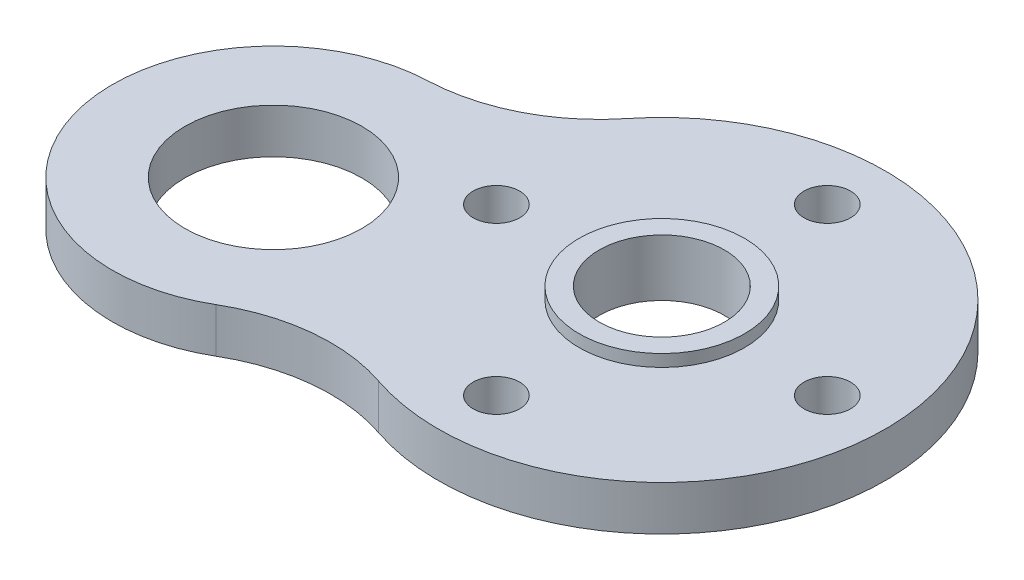
ISO-10303-21;
HEADER;
FILE_DESCRIPTION(('STEP AP214'),'2;1');
FILE_NAME('part.step','',(''),(''),'','','');
FILE_SCHEMA(('AUTOMOTIVE_DESIGN { 1 0 10303 214 1 1 1 1 }'));
ENDSEC;
DATA;
#1=APPLICATION_CONTEXT('core data for automotive mechanical design processes');
#2=APPLICATION_PROTOCOL_DEFINITION('international standard','automotive_design',2000,#1);
#3=PRODUCT_CONTEXT('',#1,'mechanical');
#4=PRODUCT('Part','Part','',(#3));
#5=PRODUCT_RELATED_PRODUCT_CATEGORY('part','',(#4));
#6=PRODUCT_DEFINITION_FORMATION('','',#4);
#7=PRODUCT_DEFINITION_CONTEXT('part definition',#1,'design');
#8=PRODUCT_DEFINITION('design','',#6,#7);
#9=PRODUCT_DEFINITION_SHAPE('','',#8);
#10=(LENGTH_UNIT() NAMED_UNIT(*) SI_UNIT(.MILLI.,.METRE.));
#11=(NAMED_UNIT(*) PLANE_ANGLE_UNIT() SI_UNIT($,.RADIAN.));
#12=(NAMED_UNIT(*) SI_UNIT($,.STERADIAN.) SOLID_ANGLE_UNIT());
#13=UNCERTAINTY_MEASURE_WITH_UNIT(LENGTH_MEASURE(1.E-05),#10,'distance_accuracy_value','');
#14=(GEOMETRIC_REPRESENTATION_CONTEXT(3) GLOBAL_UNCERTAINTY_ASSIGNED_CONTEXT((#13)) GLOBAL_UNIT_ASSIGNED_CONTEXT((#10,
#11,#12)) REPRESENTATION_CONTEXT('',''));
#15=CARTESIAN_POINT('',(0.,0.,0.));
#16=DIRECTION('',(0.,0.,1.));
#17=DIRECTION('',(1.,0.,0.));
#18=AXIS2_PLACEMENT_3D('',#15,#16,#17);
#19=CARTESIAN_POINT('',(0.,5.,0.));
#20=DIRECTION('',(0.,1.,0.));
#21=DIRECTION('',(0.,0.,1.));
#22=AXIS2_PLACEMENT_3D('',#19,#20,#21);
#23=PLANE('',#22);
#24=CARTESIAN_POINT('',(0.,5.,0.));
#25=DIRECTION('',(0.,1.,0.));
#26=DIRECTION('',(0.,0.,1.));
#27=AXIS2_PLACEMENT_3D('',#24,#25,#26);
#28=CIRCLE('',#27,9.25);
#29=CARTESIAN_POINT('',(0.,5.,-9.25));
#30=VERTEX_POINT('',#29);
#31=EDGE_CURVE('E143',#30,#30,#28,.T.);
#32=ORIENTED_EDGE('',*,*,#31,.F.);
#33=EDGE_LOOP('',(#32));
#34=FACE_BOUND('',#33,.T.);
#35=CARTESIAN_POINT('',(5.19004834727206E-13,5.,18.5));
#36=DIRECTION('',(0.,1.,0.));
#37=DIRECTION('',(0.,0.,1.));
#38=AXIS2_PLACEMENT_3D('',#35,#36,#37);
#39=CIRCLE('',#38,2.6);
#40=CARTESIAN_POINT('',(5.19004834727206E-13,5.,21.1));
#41=VERTEX_POINT('',#40);
#42=EDGE_CURVE('E128',#41,#41,#39,.T.);
#43=ORIENTED_EDGE('',*,*,#42,.F.);
#44=EDGE_LOOP('',(#43));
#45=FACE_BOUND('',#44,.T.);
#46=CARTESIAN_POINT('',(0.,5.,-18.5));
#47=DIRECTION('',(0.,1.,0.));
#48=DIRECTION('',(0.,0.,1.));
#49=AXIS2_PLACEMENT_3D('',#46,#47,#48);
#50=CIRCLE('',#49,2.6);
#51=CARTESIAN_POINT('',(0.,5.,-15.9));
#52=VERTEX_POINT('',#51);
#53=EDGE_CURVE('E115',#52,#52,#50,.T.);
#54=ORIENTED_EDGE('',*,*,#53,.F.);
#55=EDGE_LOOP('',(#54));
#56=FACE_BOUND('',#55,.T.);
#57=CARTESIAN_POINT('',(-33.5853762819475,5.,9.85));
#58=DIRECTION('',(0.,1.,0.));
#59=DIRECTION('',(0.,0.,1.));
#60=AXIS2_PLACEMENT_3D('',#57,#58,#59);
#61=CIRCLE('',#60,18.);
#62=CARTESIAN_POINT('',(-24.4886089213786,5.,25.3821866969107));
#63=VERTEX_POINT('',#62);
#64=CARTESIAN_POINT('',(-34.3186273834329,5.,-8.13505887736179));
#65=VERTEX_POINT('',#64);
#66=EDGE_CURVE('E88',#63,#65,#61,.F.);
#67=ORIENTED_EDGE('',*,*,#66,.F.);
#68=CARTESIAN_POINT('',(-14.3810896318576,5.,42.6401719157003));
#69=DIRECTION('',(0.,1.,0.));
#70=DIRECTION('',(0.,0.,1.));
#71=AXIS2_PLACEMENT_3D('',#68,#69,#70);
#72=CIRCLE('',#71,20.);
#73=CARTESIAN_POINT('',(-7.98949423992091,5.,23.6889843976113));
#74=VERTEX_POINT('',#73);
#75=EDGE_CURVE('E11',#63,#74,#72,.F.);
#76=ORIENTED_EDGE('',*,*,#75,.T.);
#77=CARTESIAN_POINT('',(0.,5.,0.));
#78=DIRECTION('',(0.,1.,0.));
#79=DIRECTION('',(0.,0.,1.));
#80=AXIS2_PLACEMENT_3D('',#77,#78,#79);
#81=CIRCLE('',#80,25.);
#82=CARTESIAN_POINT('',(-19.5185282386266,5.,-15.6213653499922));
#83=VERTEX_POINT('',#82);
#84=EDGE_CURVE('E94',#74,#83,#81,.T.);
#85=ORIENTED_EDGE('',*,*,#84,.T.);
#86=CARTESIAN_POINT('',(-35.1333508295278,5.,-28.118457629986));
#87=DIRECTION('',(0.,1.,0.));
#88=DIRECTION('',(0.,0.,1.));
#89=AXIS2_PLACEMENT_3D('',#86,#87,#88);
#90=CIRCLE('',#89,20.);
#91=EDGE_CURVE('E98',#83,#65,#90,.F.);
#92=ORIENTED_EDGE('',*,*,#91,.T.);
#93=EDGE_LOOP('',(#67,#76,#85,#92));
#94=FACE_BOUND('',#93,.T.);
#95=CARTESIAN_POINT('',(18.5,5.,0.));
#96=DIRECTION('',(0.,1.,0.));
#97=DIRECTION('',(0.,0.,1.));
#98=AXIS2_PLACEMENT_3D('',#95,#96,#97);
#99=CIRCLE('',#98,2.6);
#100=CARTESIAN_POINT('',(18.5,5.,2.60000000000006));
#101=VERTEX_POINT('',#100);
#102=EDGE_CURVE('E123',#101,#101,#99,.T.);
#103=ORIENTED_EDGE('',*,*,#102,.F.);
#104=EDGE_LOOP('',(#103));
#105=FACE_BOUND('',#104,.T.);
#106=CARTESIAN_POINT('',(-18.5,5.,-1.93777214305794E-13));
#107=DIRECTION('',(0.,1.,0.));
#108=DIRECTION('',(0.,0.,1.));
#109=AXIS2_PLACEMENT_3D('',#106,#107,#108);
#110=CIRCLE('',#109,2.6);
#111=CARTESIAN_POINT('',(-18.5,5.,2.59999999999981));
#112=VERTEX_POINT('',#111);
#113=EDGE_CURVE('E134',#112,#112,#110,.T.);
#114=ORIENTED_EDGE('',*,*,#113,.F.);
#115=EDGE_LOOP('',(#114));
#116=FACE_BOUND('',#115,.T.);
#117=CARTESIAN_POINT('',(-33.5853762819475,5.,9.85));
#118=DIRECTION('',(0.,1.,0.));
#119=DIRECTION('',(0.,0.,1.));
#120=AXIS2_PLACEMENT_3D('',#117,#118,#119);
#121=CIRCLE('',#120,9.9);
#122=CARTESIAN_POINT('',(-33.5853762819475,5.,-0.0499999999999997));
#123=VERTEX_POINT('',#122);
#124=EDGE_CURVE('E152',#123,#123,#121,.F.);
#125=ORIENTED_EDGE('',*,*,#124,.T.);
#126=EDGE_LOOP('',(#125));
#127=FACE_BOUND('',#126,.T.);
#128=ADVANCED_FACE('F43',(#34,#45,#56,#94,#105,#116,#127),#23,.T.);
#129=CARTESIAN_POINT('',(0.,0.,0.));
#130=DIRECTION('',(0.,1.,0.));
#131=DIRECTION('',(0.,0.,1.));
#132=AXIS2_PLACEMENT_3D('',#129,#130,#131);
#133=PLANE('',#132);
#134=CARTESIAN_POINT('',(0.,0.,0.));
#135=DIRECTION('',(0.,1.,0.));
#136=DIRECTION('',(0.,0.,1.));
#137=AXIS2_PLACEMENT_3D('',#134,#135,#136);
#138=CIRCLE('',#137,7.);
#139=CARTESIAN_POINT('',(0.,0.,7.));
#140=VERTEX_POINT('',#139);
#141=EDGE_CURVE('E146',#140,#140,#138,.T.);
#142=ORIENTED_EDGE('',*,*,#141,.T.);
#143=EDGE_LOOP('',(#142));
#144=FACE_BOUND('',#143,.T.);
#145=CARTESIAN_POINT('',(0.,0.,0.));
#146=DIRECTION('',(0.,1.,0.));
#147=DIRECTION('',(0.,0.,1.));
#148=AXIS2_PLACEMENT_3D('',#145,#146,#147);
#149=CIRCLE('',#148,25.);
#150=CARTESIAN_POINT('',(-7.98949423992091,0.,23.6889843976113));
#151=VERTEX_POINT('',#150);
#152=CARTESIAN_POINT('',(-19.5185282386266,0.,-15.6213653499922));
#153=VERTEX_POINT('',#152);
#154=EDGE_CURVE('E114',#151,#153,#149,.T.);
#155=ORIENTED_EDGE('',*,*,#154,.F.);
#156=CARTESIAN_POINT('',(-14.3810896318576,0.,42.6401719157003));
#157=DIRECTION('',(0.,1.,0.));
#158=DIRECTION('',(0.,0.,1.));
#159=AXIS2_PLACEMENT_3D('',#156,#157,#158);
#160=CIRCLE('',#159,20.);
#161=CARTESIAN_POINT('',(-24.4886089213786,0.,25.3821866969107));
#162=VERTEX_POINT('',#161);
#163=EDGE_CURVE('E51',#151,#162,#160,.T.);
#164=ORIENTED_EDGE('',*,*,#163,.T.);
#165=CARTESIAN_POINT('',(-33.5853762819475,0.,9.85));
#166=DIRECTION('',(0.,-1.,0.));
#167=DIRECTION('',(0.,0.,-1.));
#168=AXIS2_PLACEMENT_3D('',#165,#166,#167);
#169=CIRCLE('',#168,18.);
#170=CARTESIAN_POINT('',(-34.3186273834329,0.,-8.13505887736179));
#171=VERTEX_POINT('',#170);
#172=EDGE_CURVE('E91',#162,#171,#169,.T.);
#173=ORIENTED_EDGE('',*,*,#172,.T.);
#174=CARTESIAN_POINT('',(-35.1333508295278,0.,-28.118457629986));
#175=DIRECTION('',(0.,1.,0.));
#176=DIRECTION('',(0.,0.,1.));
#177=AXIS2_PLACEMENT_3D('',#174,#175,#176);
#178=CIRCLE('',#177,20.);
#179=EDGE_CURVE('E106',#171,#153,#178,.T.);
#180=ORIENTED_EDGE('',*,*,#179,.T.);
#181=EDGE_LOOP('',(#155,#164,#173,#180));
#182=FACE_BOUND('',#181,.T.);
#183=CARTESIAN_POINT('',(0.,0.,-18.5));
#184=DIRECTION('',(0.,1.,0.));
#185=DIRECTION('',(0.,0.,1.));
#186=AXIS2_PLACEMENT_3D('',#183,#184,#185);
#187=CIRCLE('',#186,2.6);
#188=CARTESIAN_POINT('',(0.,0.,-15.9));
#189=VERTEX_POINT('',#188);
#190=EDGE_CURVE('E119',#189,#189,#187,.T.);
#191=ORIENTED_EDGE('',*,*,#190,.T.);
#192=EDGE_LOOP('',(#191));
#193=FACE_BOUND('',#192,.T.);
#194=CARTESIAN_POINT('',(18.5,0.,0.));
#195=DIRECTION('',(0.,1.,0.));
#196=DIRECTION('',(0.,0.,1.));
#197=AXIS2_PLACEMENT_3D('',#194,#195,#196);
#198=CIRCLE('',#197,2.6);
#199=CARTESIAN_POINT('',(18.5,0.,2.60000000000006));
#200=VERTEX_POINT('',#199);
#201=EDGE_CURVE('E125',#200,#200,#198,.T.);
#202=ORIENTED_EDGE('',*,*,#201,.T.);
#203=EDGE_LOOP('',(#202));
#204=FACE_BOUND('',#203,.T.);
#205=CARTESIAN_POINT('',(5.19004834727206E-13,0.,18.5));
#206=DIRECTION('',(0.,1.,0.));
#207=DIRECTION('',(0.,0.,1.));
#208=AXIS2_PLACEMENT_3D('',#205,#206,#207);
#209=CIRCLE('',#208,2.6);
#210=CARTESIAN_POINT('',(5.19004834727206E-13,0.,21.1));
#211=VERTEX_POINT('',#210);
#212=EDGE_CURVE('E131',#211,#211,#209,.T.);
#213=ORIENTED_EDGE('',*,*,#212,.T.);
#214=EDGE_LOOP('',(#213));
#215=FACE_BOUND('',#214,.T.);
#216=CARTESIAN_POINT('',(-18.5,0.,-1.93777214305794E-13));
#217=DIRECTION('',(0.,1.,0.));
#218=DIRECTION('',(0.,0.,1.));
#219=AXIS2_PLACEMENT_3D('',#216,#217,#218);
#220=CIRCLE('',#219,2.6);
#221=CARTESIAN_POINT('',(-18.5,0.,2.59999999999981));
#222=VERTEX_POINT('',#221);
#223=EDGE_CURVE('E137',#222,#222,#220,.T.);
#224=ORIENTED_EDGE('',*,*,#223,.T.);
#225=EDGE_LOOP('',(#224));
#226=FACE_BOUND('',#225,.T.);
#227=CARTESIAN_POINT('',(-33.5853762819475,0.,9.85));
#228=DIRECTION('',(0.,-1.,0.));
#229=DIRECTION('',(0.,0.,-1.));
#230=AXIS2_PLACEMENT_3D('',#227,#228,#229);
#231=CIRCLE('',#230,9.9);
#232=CARTESIAN_POINT('',(-33.5853762819475,0.,-0.0499999999999997));
#233=VERTEX_POINT('',#232);
#234=EDGE_CURVE('E99',#233,#233,#231,.T.);
#235=ORIENTED_EDGE('',*,*,#234,.F.);
#236=EDGE_LOOP('',(#235));
#237=FACE_BOUND('',#236,.T.);
#238=ADVANCED_FACE('F112',(#144,#182,#193,#204,#215,#226,#237),#133,.F.);
#239=CARTESIAN_POINT('',(0.,5.,0.));
#240=DIRECTION('',(0.,-1.,0.));
#241=DIRECTION('',(0.,0.,-1.));
#242=AXIS2_PLACEMENT_3D('',#239,#240,#241);
#243=CYLINDRICAL_SURFACE('',#242,25.);
#244=ORIENTED_EDGE('',*,*,#154,.T.);
#245=DIRECTION('',(0.,-1.,0.));
#246=VECTOR('',#245,1.);
#247=CARTESIAN_POINT('',(-19.5185282386266,5.,-15.6213653499922));
#248=LINE('',#247,#246);
#249=EDGE_CURVE('E58',#153,#83,#248,.F.);
#250=ORIENTED_EDGE('',*,*,#249,.T.);
#251=ORIENTED_EDGE('',*,*,#84,.F.);
#252=DIRECTION('',(0.,-1.,0.));
#253=VECTOR('',#252,1.);
#254=CARTESIAN_POINT('',(-7.98949423992091,5.,23.6889843976113));
#255=LINE('',#254,#253);
#256=EDGE_CURVE('E103',#74,#151,#255,.T.);
#257=ORIENTED_EDGE('',*,*,#256,.T.);
#258=EDGE_LOOP('',(#244,#250,#251,#257));
#259=FACE_BOUND('',#258,.T.);
#260=ADVANCED_FACE('F165',(#259),#243,.T.);
#261=CARTESIAN_POINT('',(0.,5.,-18.5));
#262=DIRECTION('',(0.,-1.,0.));
#263=DIRECTION('',(0.,0.,-1.));
#264=AXIS2_PLACEMENT_3D('',#261,#262,#263);
#265=CYLINDRICAL_SURFACE('',#264,2.6);
#266=ORIENTED_EDGE('',*,*,#53,.T.);
#267=EDGE_LOOP('',(#266));
#268=FACE_BOUND('',#267,.T.);
#269=ORIENTED_EDGE('',*,*,#190,.F.);
#270=EDGE_LOOP('',(#269));
#271=FACE_BOUND('',#270,.T.);
#272=ADVANCED_FACE('F172',(#268,#271),#265,.F.);
#273=CARTESIAN_POINT('',(18.5,5.,0.));
#274=DIRECTION('',(0.,-1.,0.));
#275=DIRECTION('',(0.,0.,-1.));
#276=AXIS2_PLACEMENT_3D('',#273,#274,#275);
#277=CYLINDRICAL_SURFACE('',#276,2.6);
#278=ORIENTED_EDGE('',*,*,#102,.T.);
#279=EDGE_LOOP('',(#278));
#280=FACE_BOUND('',#279,.T.);
#281=ORIENTED_EDGE('',*,*,#201,.F.);
#282=EDGE_LOOP('',(#281));
#283=FACE_BOUND('',#282,.T.);
#284=ADVANCED_FACE('F209',(#280,#283),#277,.F.);
#285=CARTESIAN_POINT('',(5.19004834727206E-13,5.,18.5));
#286=DIRECTION('',(0.,-1.,0.));
#287=DIRECTION('',(0.,0.,-1.));
#288=AXIS2_PLACEMENT_3D('',#285,#286,#287);
#289=CYLINDRICAL_SURFACE('',#288,2.6);
#290=ORIENTED_EDGE('',*,*,#42,.T.);
#291=EDGE_LOOP('',(#290));
#292=FACE_BOUND('',#291,.T.);
#293=ORIENTED_EDGE('',*,*,#212,.F.);
#294=EDGE_LOOP('',(#293));
#295=FACE_BOUND('',#294,.T.);
#296=ADVANCED_FACE('F205',(#292,#295),#289,.F.);
#297=CARTESIAN_POINT('',(-18.5,5.,-1.93777214305794E-13));
#298=DIRECTION('',(0.,-1.,0.));
#299=DIRECTION('',(0.,0.,-1.));
#300=AXIS2_PLACEMENT_3D('',#297,#298,#299);
#301=CYLINDRICAL_SURFACE('',#300,2.6);
#302=ORIENTED_EDGE('',*,*,#113,.T.);
#303=EDGE_LOOP('',(#302));
#304=FACE_BOUND('',#303,.T.);
#305=ORIENTED_EDGE('',*,*,#223,.F.);
#306=EDGE_LOOP('',(#305));
#307=FACE_BOUND('',#306,.T.);
#308=ADVANCED_FACE('F201',(#304,#307),#301,.F.);
#309=CARTESIAN_POINT('',(0.,6.35,0.));
#310=DIRECTION('',(0.,-1.,0.));
#311=DIRECTION('',(0.,0.,-1.));
#312=AXIS2_PLACEMENT_3D('',#309,#310,#311);
#313=CYLINDRICAL_SURFACE('',#312,9.25);
#314=CARTESIAN_POINT('',(0.,6.35,0.));
#315=DIRECTION('',(0.,1.,0.));
#316=DIRECTION('',(0.,0.,1.));
#317=AXIS2_PLACEMENT_3D('',#314,#315,#316);
#318=CIRCLE('',#317,9.25);
#319=CARTESIAN_POINT('',(0.,6.35,-9.25));
#320=VERTEX_POINT('',#319);
#321=EDGE_CURVE('E140',#320,#320,#318,.T.);
#322=CARTESIAN_POINT('',(0.,6.35,-9.25));
#323=CARTESIAN_POINT('',(0.,6.3359375,-9.25));
#324=CARTESIAN_POINT('',(0.,6.321875,-9.25));
#325=CARTESIAN_POINT('',(0.,6.29375,-9.25));
#326=CARTESIAN_POINT('',(0.,6.2796875,-9.25));
#327=CARTESIAN_POINT('',(0.,6.2515625,-9.25));
#328=CARTESIAN_POINT('',(0.,6.2375,-9.25));
#329=CARTESIAN_POINT('',(0.,6.209375,-9.25));
#330=CARTESIAN_POINT('',(0.,6.1953125,-9.25));
#331=CARTESIAN_POINT('',(0.,6.1671875,-9.25));
#332=CARTESIAN_POINT('',(0.,6.153125,-9.25));
#333=CARTESIAN_POINT('',(0.,6.125,-9.25));
#334=CARTESIAN_POINT('',(0.,6.1109375,-9.25));
#335=CARTESIAN_POINT('',(0.,6.0828125,-9.25));
#336=CARTESIAN_POINT('',(0.,6.06875,-9.25));
#337=CARTESIAN_POINT('',(0.,6.040625,-9.25));
#338=CARTESIAN_POINT('',(0.,6.0265625,-9.25));
#339=CARTESIAN_POINT('',(0.,5.9984375,-9.25));
#340=CARTESIAN_POINT('',(0.,5.984375,-9.25));
#341=CARTESIAN_POINT('',(0.,5.95625,-9.25));
#342=CARTESIAN_POINT('',(0.,5.9421875,-9.25));
#343=CARTESIAN_POINT('',(0.,5.9140625,-9.25));
#344=CARTESIAN_POINT('',(0.,5.9,-9.25));
#345=CARTESIAN_POINT('',(0.,5.871875,-9.25));
#346=CARTESIAN_POINT('',(0.,5.8578125,-9.25));
#347=CARTESIAN_POINT('',(0.,5.8296875,-9.25));
#348=CARTESIAN_POINT('',(0.,5.815625,-9.25));
#349=CARTESIAN_POINT('',(0.,5.7875,-9.25));
#350=CARTESIAN_POINT('',(0.,5.7734375,-9.25));
#351=CARTESIAN_POINT('',(0.,5.7453125,-9.25));
#352=CARTESIAN_POINT('',(0.,5.73125,-9.25));
#353=CARTESIAN_POINT('',(0.,5.703125,-9.25));
#354=CARTESIAN_POINT('',(0.,5.6890625,-9.25));
#355=CARTESIAN_POINT('',(0.,5.6609375,-9.25));
#356=CARTESIAN_POINT('',(0.,5.646875,-9.25));
#357=CARTESIAN_POINT('',(0.,5.61875,-9.25));
#358=CARTESIAN_POINT('',(0.,5.6046875,-9.25));
#359=CARTESIAN_POINT('',(0.,5.5765625,-9.25));
#360=CARTESIAN_POINT('',(0.,5.5625,-9.25));
#361=CARTESIAN_POINT('',(0.,5.534375,-9.25));
#362=CARTESIAN_POINT('',(0.,5.5203125,-9.25));
#363=CARTESIAN_POINT('',(0.,5.4921875,-9.25));
#364=CARTESIAN_POINT('',(0.,5.478125,-9.25));
#365=CARTESIAN_POINT('',(0.,5.45,-9.25));
#366=CARTESIAN_POINT('',(0.,5.4359375,-9.25));
#367=CARTESIAN_POINT('',(0.,5.4078125,-9.25));
#368=CARTESIAN_POINT('',(0.,5.39375,-9.25));
#369=CARTESIAN_POINT('',(0.,5.365625,-9.25));
#370=CARTESIAN_POINT('',(0.,5.3515625,-9.25));
#371=CARTESIAN_POINT('',(0.,5.3234375,-9.25));
#372=CARTESIAN_POINT('',(0.,5.309375,-9.25));
#373=CARTESIAN_POINT('',(0.,5.28125,-9.25));
#374=CARTESIAN_POINT('',(0.,5.2671875,-9.25));
#375=CARTESIAN_POINT('',(0.,5.2390625,-9.25));
#376=CARTESIAN_POINT('',(0.,5.225,-9.25));
#377=CARTESIAN_POINT('',(0.,5.196875,-9.25));
#378=CARTESIAN_POINT('',(0.,5.1828125,-9.25));
#379=CARTESIAN_POINT('',(0.,5.1546875,-9.25));
#380=CARTESIAN_POINT('',(0.,5.140625,-9.25));
#381=CARTESIAN_POINT('',(0.,5.1125,-9.25));
#382=CARTESIAN_POINT('',(0.,5.0984375,-9.25));
#383=CARTESIAN_POINT('',(0.,5.0703125,-9.25));
#384=CARTESIAN_POINT('',(0.,5.05625,-9.25));
#385=CARTESIAN_POINT('',(0.,5.028125,-9.25));
#386=CARTESIAN_POINT('',(0.,5.0140625,-9.25));
#387=CARTESIAN_POINT('',(0.,5.,-9.25));
#388=B_SPLINE_CURVE_WITH_KNOTS('',3,(#322,#323,#324,#325,#326,#327,#328,#329,#330,#331,#332,
#333,#334,#335,#336,#337,#338,#339,#340,#341,#342,#343,#344,#345,#346,#347,#348,#349,#350,#351,
#352,#353,#354,#355,#356,#357,#358,#359,#360,#361,#362,#363,#364,#365,#366,#367,#368,#369,#370,
#371,#372,#373,#374,#375,#376,#377,#378,#379,#380,#381,#382,#383,#384,#385,#386,#387),
.UNSPECIFIED.,.F.,.F.,(4,2,2,2,2,2,2,2,2,2,2,2,2,2,2,2,2,2,2,2,2,2,2,2,2,2,2,2,2,2,2,2,4),(0.,
0.0421875000000006,0.0843750000000003,0.1265625,0.168750000000001,0.2109375,0.253125,0.2953125,
0.3375,0.379687500000001,0.421875,0.4640625,0.50625,0.5484375,0.590625,0.6328125,0.675,
0.7171875,0.759375,0.8015625,0.84375,0.8859375,0.928125,0.9703125,1.0125,1.0546875,1.096875,
1.1390625,1.18125,1.2234375,1.265625,1.3078125,1.35),.UNSPECIFIED.);
#389=EDGE_CURVE('BSEAM197',#320,#30,#388,.T.);
#390=ORIENTED_EDGE('',*,*,#321,.F.);
#391=ORIENTED_EDGE('',*,*,#31,.T.);
#392=ORIENTED_EDGE('',*,*,#389,.T.);
#393=ORIENTED_EDGE('',*,*,#389,.F.);
#394=EDGE_LOOP('',(#390,#392,#391,#393));
#395=FACE_BOUND('',#394,.T.);
#396=ADVANCED_FACE('F197',(#395),#313,.T.);
#397=CARTESIAN_POINT('',(0.,6.35,0.));
#398=DIRECTION('',(0.,1.,0.));
#399=DIRECTION('',(0.,0.,1.));
#400=AXIS2_PLACEMENT_3D('',#397,#398,#399);
#401=PLANE('',#400);
#402=CARTESIAN_POINT('',(0.,6.35,0.));
#403=DIRECTION('',(0.,1.,0.));
#404=DIRECTION('',(0.,0.,1.));
#405=AXIS2_PLACEMENT_3D('',#402,#403,#404);
#406=CIRCLE('',#405,7.);
#407=CARTESIAN_POINT('',(0.,6.35,7.));
#408=VERTEX_POINT('',#407);
#409=EDGE_CURVE('E149',#408,#408,#406,.T.);
#410=ORIENTED_EDGE('',*,*,#409,.F.);
#411=EDGE_LOOP('',(#410));
#412=FACE_BOUND('',#411,.T.);
#413=ORIENTED_EDGE('',*,*,#321,.T.);
#414=EDGE_LOOP('',(#413));
#415=FACE_BOUND('',#414,.T.);
#416=ADVANCED_FACE('F193',(#412,#415),#401,.T.);
#417=CARTESIAN_POINT('',(0.,0.,0.));
#418=DIRECTION('',(0.,1.,0.));
#419=DIRECTION('',(0.,0.,1.));
#420=AXIS2_PLACEMENT_3D('',#417,#418,#419);
#421=CYLINDRICAL_SURFACE('',#420,7.);
#422=ORIENTED_EDGE('',*,*,#141,.F.);
#423=EDGE_LOOP('',(#422));
#424=FACE_BOUND('',#423,.T.);
#425=ORIENTED_EDGE('',*,*,#409,.T.);
#426=EDGE_LOOP('',(#425));
#427=FACE_BOUND('',#426,.T.);
#428=ADVANCED_FACE('F189',(#424,#427),#421,.F.);
#429=CARTESIAN_POINT('',(-33.5853762819475,54.5936162428813,9.85));
#430=DIRECTION('',(0.,-1.,0.));
#431=DIRECTION('',(0.,0.,-1.));
#432=AXIS2_PLACEMENT_3D('',#429,#430,#431);
#433=CYLINDRICAL_SURFACE('',#432,18.);
#434=ORIENTED_EDGE('',*,*,#66,.T.);
#435=DIRECTION('',(0.,-1.,0.));
#436=VECTOR('',#435,1.);
#437=CARTESIAN_POINT('',(-34.3186273834329,54.5936162428813,-8.1350588773618));
#438=LINE('',#437,#436);
#439=EDGE_CURVE('E93',#65,#171,#438,.T.);
#440=ORIENTED_EDGE('',*,*,#439,.T.);
#441=ORIENTED_EDGE('',*,*,#172,.F.);
#442=DIRECTION('',(0.,-1.,0.));
#443=VECTOR('',#442,1.);
#444=CARTESIAN_POINT('',(-24.4886089213786,54.5936162428813,25.3821866969107));
#445=LINE('',#444,#443);
#446=EDGE_CURVE('E85',#162,#63,#445,.F.);
#447=ORIENTED_EDGE('',*,*,#446,.T.);
#448=EDGE_LOOP('',(#434,#440,#441,#447));
#449=FACE_BOUND('',#448,.T.);
#450=ADVANCED_FACE('F86',(#449),#433,.T.);
#451=CARTESIAN_POINT('',(-33.5853762819475,54.5936162428813,9.85));
#452=DIRECTION('',(0.,-1.,0.));
#453=DIRECTION('',(0.,0.,-1.));
#454=AXIS2_PLACEMENT_3D('',#451,#452,#453);
#455=CYLINDRICAL_SURFACE('',#454,9.9);
#456=CARTESIAN_POINT('',(-33.5853762819475,0.,-0.0499999999999997));
#457=CARTESIAN_POINT('',(-33.5853762819475,0.0520833333333392,-0.0499999999999997));
#458=CARTESIAN_POINT('',(-33.5853762819475,0.104166666666671,-0.0499999999999997));
#459=CARTESIAN_POINT('',(-33.5853762819475,0.208333333333338,-0.0499999999999997));
#460=CARTESIAN_POINT('',(-33.5853762819475,0.260416666666673,-0.0499999999999997));
#461=CARTESIAN_POINT('',(-33.5853762819475,0.364583333333339,-0.0499999999999997));
#462=CARTESIAN_POINT('',(-33.5853762819475,0.416666666666672,-0.0499999999999997));
#463=CARTESIAN_POINT('',(-33.5853762819475,0.520833333333338,-0.0499999999999997));
#464=CARTESIAN_POINT('',(-33.5853762819475,0.572916666666673,-0.0499999999999997));
#465=CARTESIAN_POINT('',(-33.5853762819475,0.67708333333334,-0.0499999999999997));
#466=CARTESIAN_POINT('',(-33.5853762819475,0.729166666666672,-0.0499999999999997));
#467=CARTESIAN_POINT('',(-33.5853762819475,0.833333333333339,-0.0499999999999997));
#468=CARTESIAN_POINT('',(-33.5853762819475,0.885416666666673,-0.0499999999999997));
#469=CARTESIAN_POINT('',(-33.5853762819475,0.98958333333334,-0.0499999999999997));
#470=CARTESIAN_POINT('',(-33.5853762819475,1.04166666666667,-0.0499999999999997));
#471=CARTESIAN_POINT('',(-33.5853762819475,1.14583333333334,-0.0499999999999997));
#472=CARTESIAN_POINT('',(-33.5853762819475,1.19791666666667,-0.0499999999999997));
#473=CARTESIAN_POINT('',(-33.5853762819475,1.30208333333334,-0.0499999999999997));
#474=CARTESIAN_POINT('',(-33.5853762819475,1.35416666666667,-0.0499999999999997));
#475=CARTESIAN_POINT('',(-33.5853762819475,1.45833333333334,-0.0499999999999997));
#476=CARTESIAN_POINT('',(-33.5853762819475,1.51041666666667,-0.0499999999999997));
#477=CARTESIAN_POINT('',(-33.5853762819475,1.61458333333334,-0.0499999999999997));
#478=CARTESIAN_POINT('',(-33.5853762819475,1.66666666666667,-0.0499999999999997));
#479=CARTESIAN_POINT('',(-33.5853762819475,1.77083333333334,-0.0499999999999997));
#480=CARTESIAN_POINT('',(-33.5853762819475,1.82291666666667,-0.0499999999999997));
#481=CARTESIAN_POINT('',(-33.5853762819475,1.92708333333334,-0.0499999999999997));
#482=CARTESIAN_POINT('',(-33.5853762819475,1.97916666666667,-0.0499999999999997));
#483=CARTESIAN_POINT('',(-33.5853762819475,2.08333333333334,-0.0499999999999997));
#484=CARTESIAN_POINT('',(-33.5853762819475,2.13541666666667,-0.0499999999999997));
#485=CARTESIAN_POINT('',(-33.5853762819475,2.23958333333334,-0.0499999999999997));
#486=CARTESIAN_POINT('',(-33.5853762819475,2.29166666666667,-0.0499999999999997));
#487=CARTESIAN_POINT('',(-33.5853762819475,2.39583333333334,-0.0499999999999997));
#488=CARTESIAN_POINT('',(-33.5853762819475,2.44791666666667,-0.0499999999999997));
#489=CARTESIAN_POINT('',(-33.5853762819475,2.55208333333333,-0.0499999999999997));
#490=CARTESIAN_POINT('',(-33.5853762819475,2.60416666666667,-0.0499999999999997));
#491=CARTESIAN_POINT('',(-33.5853762819475,2.70833333333333,-0.0499999999999997));
#492=CARTESIAN_POINT('',(-33.5853762819475,2.76041666666667,-0.0499999999999997));
#493=CARTESIAN_POINT('',(-33.5853762819475,2.86458333333333,-0.0499999999999997));
#494=CARTESIAN_POINT('',(-33.5853762819475,2.91666666666667,-0.0499999999999997));
#495=CARTESIAN_POINT('',(-33.5853762819475,3.02083333333333,-0.0499999999999997));
#496=CARTESIAN_POINT('',(-33.5853762819475,3.07291666666667,-0.0499999999999997));
#497=CARTESIAN_POINT('',(-33.5853762819475,3.17708333333334,-0.0499999999999997));
#498=CARTESIAN_POINT('',(-33.5853762819475,3.22916666666667,-0.0499999999999997));
#499=CARTESIAN_POINT('',(-33.5853762819475,3.33333333333333,-0.0499999999999997));
#500=CARTESIAN_POINT('',(-33.5853762819475,3.38541666666667,-0.0499999999999997));
#501=CARTESIAN_POINT('',(-33.5853762819475,3.48958333333334,-0.0499999999999997));
#502=CARTESIAN_POINT('',(-33.5853762819475,3.54166666666667,-0.0499999999999997));
#503=CARTESIAN_POINT('',(-33.5853762819475,3.64583333333333,-0.0499999999999997));
#504=CARTESIAN_POINT('',(-33.5853762819475,3.69791666666666,-0.0499999999999997));
#505=CARTESIAN_POINT('',(-33.5853762819475,3.80208333333333,-0.0499999999999997));
#506=CARTESIAN_POINT('',(-33.5853762819475,3.85416666666667,-0.0499999999999997));
#507=CARTESIAN_POINT('',(-33.5853762819475,3.95833333333333,-0.0499999999999997));
#508=CARTESIAN_POINT('',(-33.5853762819475,4.01041666666666,-0.0499999999999997));
#509=CARTESIAN_POINT('',(-33.5853762819475,4.11458333333333,-0.0499999999999997));
#510=CARTESIAN_POINT('',(-33.5853762819475,4.16666666666667,-0.0499999999999997));
#511=CARTESIAN_POINT('',(-33.5853762819475,4.27083333333333,-0.0499999999999997));
#512=CARTESIAN_POINT('',(-33.5853762819475,4.32291666666667,-0.0499999999999997));
#513=CARTESIAN_POINT('',(-33.5853762819475,4.42708333333333,-0.0499999999999997));
#514=CARTESIAN_POINT('',(-33.5853762819475,4.47916666666667,-0.0499999999999997));
#515=CARTESIAN_POINT('',(-33.5853762819475,4.58333333333333,-0.0499999999999997));
#516=CARTESIAN_POINT('',(-33.5853762819475,4.63541666666667,-0.0499999999999997));
#517=CARTESIAN_POINT('',(-33.5853762819475,4.73958333333333,-0.0499999999999997));
#518=CARTESIAN_POINT('',(-33.5853762819475,4.79166666666667,-0.0499999999999997));
#519=CARTESIAN_POINT('',(-33.5853762819475,4.89583333333333,-0.0499999999999997));
#520=CARTESIAN_POINT('',(-33.5853762819475,4.94791666666667,-0.0499999999999997));
#521=CARTESIAN_POINT('',(-33.5853762819475,5.,-0.0499999999999997));
#522=B_SPLINE_CURVE_WITH_KNOTS('',3,(#456,#457,#458,#459,#460,#461,#462,#463,#464,#465,#466,
#467,#468,#469,#470,#471,#472,#473,#474,#475,#476,#477,#478,#479,#480,#481,#482,#483,#484,#485,
#486,#487,#488,#489,#490,#491,#492,#493,#494,#495,#496,#497,#498,#499,#500,#501,#502,#503,#504,
#505,#506,#507,#508,#509,#510,#511,#512,#513,#514,#515,#516,#517,#518,#519,#520,#521),
.UNSPECIFIED.,.F.,.F.,(4,2,2,2,2,2,2,2,2,2,2,2,2,2,2,2,2,2,2,2,2,2,2,2,2,2,2,2,2,2,2,2,4),(0.,
0.156249999999997,0.3125,0.468749999999997,0.625000000000001,0.781249999999997,
0.937500000000001,1.09375,1.25,1.40625,1.56249999999999,1.71875,1.87499999999999,2.03125,2.1875,
2.34375,2.5,2.65624999999999,2.8125,2.96874999999999,3.125,3.28124999999999,3.4375,
3.59374999999999,3.74999999999999,3.90624999999999,4.06249999999999,4.21874999999999,
4.37499999999999,4.53124999999999,4.68749999999999,4.84374999999999,4.99999999999999),.UNSPECIFIED.);
#523=EDGE_CURVE('BSEAM161',#233,#123,#522,.T.);
#524=ORIENTED_EDGE('',*,*,#234,.T.);
#525=ORIENTED_EDGE('',*,*,#124,.F.);
#526=ORIENTED_EDGE('',*,*,#523,.T.);
#527=ORIENTED_EDGE('',*,*,#523,.F.);
#528=EDGE_LOOP('',(#524,#526,#525,#527));
#529=FACE_BOUND('',#528,.T.);
#530=ADVANCED_FACE('F161',(#529),#455,.F.);
#531=CARTESIAN_POINT('',(-35.1333508295278,5.,-28.118457629986));
#532=DIRECTION('',(0.,1.,0.));
#533=DIRECTION('',(0.,0.,1.));
#534=AXIS2_PLACEMENT_3D('',#531,#532,#533);
#535=CYLINDRICAL_SURFACE('',#534,20.);
#536=ORIENTED_EDGE('',*,*,#91,.F.);
#537=ORIENTED_EDGE('',*,*,#249,.F.);
#538=ORIENTED_EDGE('',*,*,#179,.F.);
#539=ORIENTED_EDGE('',*,*,#439,.F.);
#540=EDGE_LOOP('',(#536,#537,#538,#539));
#541=FACE_BOUND('',#540,.T.);
#542=ADVANCED_FACE('F177',(#541),#535,.F.);
#543=CARTESIAN_POINT('',(-14.3810896318576,54.5936162428813,42.6401719157003));
#544=DIRECTION('',(0.,1.,0.));
#545=DIRECTION('',(0.,0.,1.));
#546=AXIS2_PLACEMENT_3D('',#543,#544,#545);
#547=CYLINDRICAL_SURFACE('',#546,20.);
#548=ORIENTED_EDGE('',*,*,#75,.F.);
#549=ORIENTED_EDGE('',*,*,#446,.F.);
#550=ORIENTED_EDGE('',*,*,#163,.F.);
#551=ORIENTED_EDGE('',*,*,#256,.F.);
#552=EDGE_LOOP('',(#548,#549,#550,#551));
#553=FACE_BOUND('',#552,.T.);
#554=ADVANCED_FACE('F45',(#553),#547,.F.);
#555=CLOSED_SHELL('',(#128,#238,#260,#272,#284,#296,#308,#396,#416,#428,#450,#530,#542,#554));
#556=MANIFOLD_SOLID_BREP('B2',#555);
#557=ADVANCED_BREP_SHAPE_REPRESENTATION('',(#18,#556),#14);
#558=SHAPE_DEFINITION_REPRESENTATION(#9,#557);
ENDSEC;
END-ISO-10303-21;
